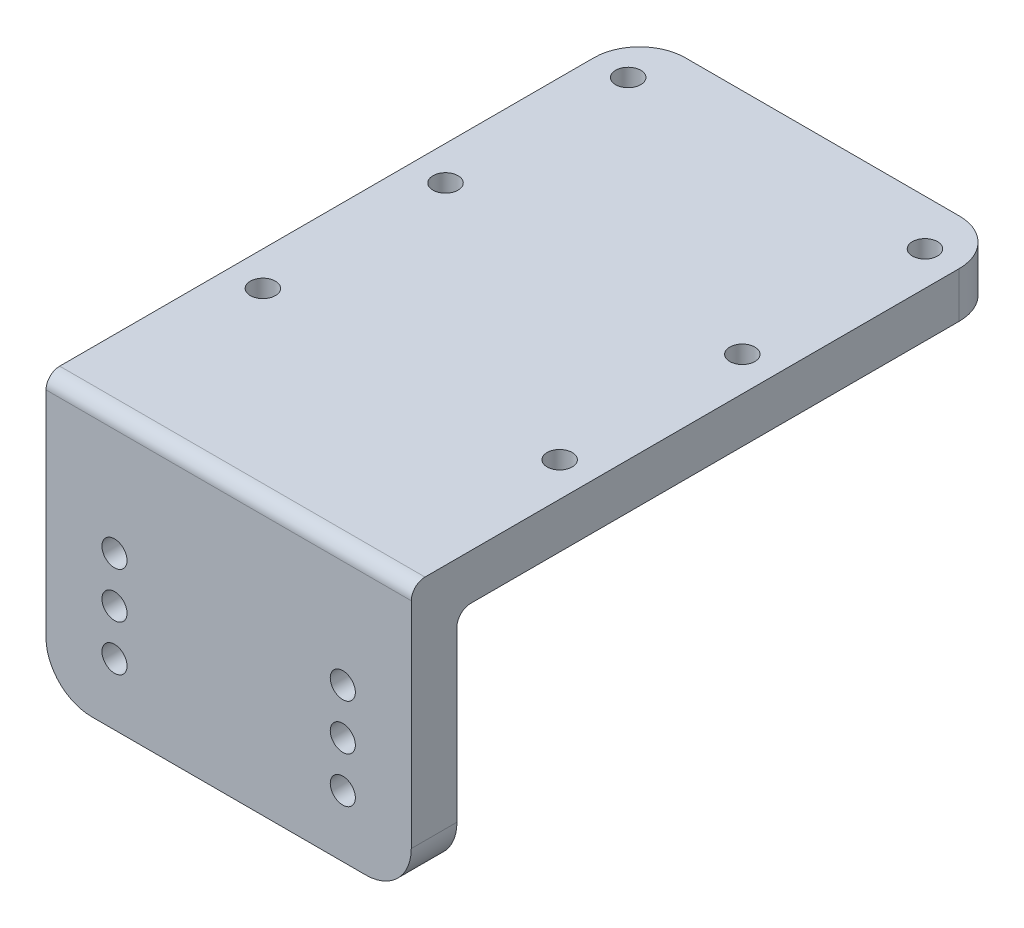
ISO-10303-21;
HEADER;
FILE_DESCRIPTION(('STEP AP214'),'2;1');
FILE_NAME('part.step','',(''),(''),'','','');
FILE_SCHEMA(('AUTOMOTIVE_DESIGN { 1 0 10303 214 1 1 1 1 }'));
ENDSEC;
DATA;
#1=APPLICATION_CONTEXT('core data for automotive mechanical design processes');
#2=APPLICATION_PROTOCOL_DEFINITION('international standard','automotive_design',2000,#1);
#3=PRODUCT_CONTEXT('',#1,'mechanical');
#4=PRODUCT('Part','Part','',(#3));
#5=PRODUCT_RELATED_PRODUCT_CATEGORY('part','',(#4));
#6=PRODUCT_DEFINITION_FORMATION('','',#4);
#7=PRODUCT_DEFINITION_CONTEXT('part definition',#1,'design');
#8=PRODUCT_DEFINITION('design','',#6,#7);
#9=PRODUCT_DEFINITION_SHAPE('','',#8);
#10=(LENGTH_UNIT() NAMED_UNIT(*) SI_UNIT(.MILLI.,.METRE.));
#11=(NAMED_UNIT(*) PLANE_ANGLE_UNIT() SI_UNIT($,.RADIAN.));
#12=(NAMED_UNIT(*) SI_UNIT($,.STERADIAN.) SOLID_ANGLE_UNIT());
#13=UNCERTAINTY_MEASURE_WITH_UNIT(LENGTH_MEASURE(1.E-05),#10,'distance_accuracy_value','');
#14=(GEOMETRIC_REPRESENTATION_CONTEXT(3) GLOBAL_UNCERTAINTY_ASSIGNED_CONTEXT((#13)) GLOBAL_UNIT_ASSIGNED_CONTEXT((#10,
#11,#12)) REPRESENTATION_CONTEXT('',''));
#15=CARTESIAN_POINT('',(0.,0.,0.));
#16=DIRECTION('',(0.,0.,1.));
#17=DIRECTION('',(1.,0.,0.));
#18=AXIS2_PLACEMENT_3D('',#15,#16,#17);
#19=CARTESIAN_POINT('',(0.,0.,0.));
#20=DIRECTION('',(0.,0.,1.));
#21=DIRECTION('',(1.,0.,0.));
#22=AXIS2_PLACEMENT_3D('',#19,#20,#21);
#23=PLANE('',#22);
#24=CARTESIAN_POINT('',(-25.,3.50000000000001,0.));
#25=DIRECTION('',(0.,0.,-1.));
#26=DIRECTION('',(-1.,0.,0.));
#27=AXIS2_PLACEMENT_3D('',#24,#25,#26);
#28=CIRCLE('',#27,2.75);
#29=CARTESIAN_POINT('',(-27.75,3.50000000000001,0.));
#30=VERTEX_POINT('',#29);
#31=EDGE_CURVE('E250',#30,#30,#28,.T.);
#32=ORIENTED_EDGE('',*,*,#31,.F.);
#33=EDGE_LOOP('',(#32));
#34=FACE_BOUND('',#33,.T.);
#35=CARTESIAN_POINT('',(-25.,-16.5,0.));
#36=DIRECTION('',(0.,0.,-1.));
#37=DIRECTION('',(-1.,0.,0.));
#38=AXIS2_PLACEMENT_3D('',#35,#36,#37);
#39=CIRCLE('',#38,2.75);
#40=CARTESIAN_POINT('',(-27.75,-16.5,0.));
#41=VERTEX_POINT('',#40);
#42=EDGE_CURVE('E268',#41,#41,#39,.T.);
#43=ORIENTED_EDGE('',*,*,#42,.F.);
#44=EDGE_LOOP('',(#43));
#45=FACE_BOUND('',#44,.T.);
#46=CARTESIAN_POINT('',(-25.,-6.49999999999999,0.));
#47=DIRECTION('',(0.,0.,-1.));
#48=DIRECTION('',(-1.,0.,0.));
#49=AXIS2_PLACEMENT_3D('',#46,#47,#48);
#50=CIRCLE('',#49,2.75);
#51=CARTESIAN_POINT('',(-27.75,-6.49999999999999,0.));
#52=VERTEX_POINT('',#51);
#53=EDGE_CURVE('E256',#52,#52,#50,.T.);
#54=ORIENTED_EDGE('',*,*,#53,.F.);
#55=EDGE_LOOP('',(#54));
#56=FACE_BOUND('',#55,.T.);
#57=DIRECTION('',(0.,-1.,0.));
#58=VECTOR('',#57,1.);
#59=CARTESIAN_POINT('',(-40.,30.,0.));
#60=LINE('',#59,#58);
#61=CARTESIAN_POINT('',(-40.,17.,0.));
#62=VERTEX_POINT('',#61);
#63=CARTESIAN_POINT('',(-40.,-20.,0.));
#64=VERTEX_POINT('',#63);
#65=EDGE_CURVE('E120',#62,#64,#60,.T.);
#66=ORIENTED_EDGE('',*,*,#65,.F.);
#67=DIRECTION('',(-1.,0.,0.));
#68=VECTOR('',#67,1.);
#69=CARTESIAN_POINT('',(-5.,17.,0.));
#70=LINE('',#69,#68);
#71=CARTESIAN_POINT('',(-8.,17.,0.));
#72=VERTEX_POINT('',#71);
#73=EDGE_CURVE('E108',#62,#72,#70,.F.);
#74=ORIENTED_EDGE('',*,*,#73,.T.);
#75=DIRECTION('',(0.,1.,0.));
#76=VECTOR('',#75,1.);
#77=CARTESIAN_POINT('',(-8.,-30.,0.));
#78=LINE('',#77,#76);
#79=CARTESIAN_POINT('',(-8.,-30.,0.));
#80=VERTEX_POINT('',#79);
#81=EDGE_CURVE('E152',#72,#80,#78,.F.);
#82=ORIENTED_EDGE('',*,*,#81,.T.);
#83=DIRECTION('',(1.,0.,0.));
#84=VECTOR('',#83,1.);
#85=CARTESIAN_POINT('',(-40.,-30.,0.));
#86=LINE('',#85,#84);
#87=CARTESIAN_POINT('',(-30.,-30.,0.));
#88=VERTEX_POINT('',#87);
#89=EDGE_CURVE('E297',#88,#80,#86,.T.);
#90=ORIENTED_EDGE('',*,*,#89,.F.);
#91=CARTESIAN_POINT('',(-30.,-20.,0.));
#92=DIRECTION('',(0.,0.,1.));
#93=DIRECTION('',(1.,0.,0.));
#94=AXIS2_PLACEMENT_3D('',#91,#92,#93);
#95=CIRCLE('',#94,10.);
#96=EDGE_CURVE('E339',#88,#64,#95,.F.);
#97=ORIENTED_EDGE('',*,*,#96,.T.);
#98=EDGE_LOOP('',(#66,#74,#82,#90,#97));
#99=FACE_BOUND('',#98,.T.);
#100=ADVANCED_FACE('F34',(#34,#45,#56,#99),#23,.F.);
#101=CARTESIAN_POINT('',(25.,-16.5,0.));
#102=DIRECTION('',(0.,0.,-1.));
#103=DIRECTION('',(-1.,0.,0.));
#104=AXIS2_PLACEMENT_3D('',#101,#102,#103);
#105=CIRCLE('',#104,2.75);
#106=CARTESIAN_POINT('',(22.25,-16.5,0.));
#107=VERTEX_POINT('',#106);
#108=EDGE_CURVE('E280',#107,#107,#105,.T.);
#109=ORIENTED_EDGE('',*,*,#108,.F.);
#110=EDGE_LOOP('',(#109));
#111=FACE_BOUND('',#110,.T.);
#112=CARTESIAN_POINT('',(25.,-6.49999999999999,0.));
#113=DIRECTION('',(0.,0.,-1.));
#114=DIRECTION('',(-1.,0.,0.));
#115=AXIS2_PLACEMENT_3D('',#112,#113,#114);
#116=CIRCLE('',#115,2.75);
#117=CARTESIAN_POINT('',(22.25,-6.49999999999999,0.));
#118=VERTEX_POINT('',#117);
#119=EDGE_CURVE('E275',#118,#118,#116,.T.);
#120=ORIENTED_EDGE('',*,*,#119,.F.);
#121=EDGE_LOOP('',(#120));
#122=FACE_BOUND('',#121,.T.);
#123=CARTESIAN_POINT('',(25.,3.50000000000001,0.));
#124=DIRECTION('',(0.,0.,-1.));
#125=DIRECTION('',(-1.,0.,0.));
#126=AXIS2_PLACEMENT_3D('',#123,#124,#125);
#127=CIRCLE('',#126,2.75);
#128=CARTESIAN_POINT('',(22.25,3.50000000000001,0.));
#129=VERTEX_POINT('',#128);
#130=EDGE_CURVE('E263',#129,#129,#127,.T.);
#131=ORIENTED_EDGE('',*,*,#130,.F.);
#132=EDGE_LOOP('',(#131));
#133=FACE_BOUND('',#132,.T.);
#134=CARTESIAN_POINT('',(8.,-30.,0.));
#135=VERTEX_POINT('',#134);
#136=CARTESIAN_POINT('',(30.,-30.,0.));
#137=VERTEX_POINT('',#136);
#138=EDGE_CURVE('E306',#135,#137,#86,.T.);
#139=ORIENTED_EDGE('',*,*,#138,.F.);
#140=DIRECTION('',(0.,-1.,0.));
#141=VECTOR('',#140,1.);
#142=CARTESIAN_POINT('',(8.,20.,0.));
#143=LINE('',#142,#141);
#144=CARTESIAN_POINT('',(8.,17.,0.));
#145=VERTEX_POINT('',#144);
#146=EDGE_CURVE('E103',#135,#145,#143,.F.);
#147=ORIENTED_EDGE('',*,*,#146,.T.);
#148=DIRECTION('',(-1.,0.,0.));
#149=VECTOR('',#148,1.);
#150=CARTESIAN_POINT('',(40.,17.,0.));
#151=LINE('',#150,#149);
#152=CARTESIAN_POINT('',(40.,17.,0.));
#153=VERTEX_POINT('',#152);
#154=EDGE_CURVE('E96',#145,#153,#151,.F.);
#155=ORIENTED_EDGE('',*,*,#154,.T.);
#156=DIRECTION('',(0.,1.,0.));
#157=VECTOR('',#156,1.);
#158=CARTESIAN_POINT('',(40.,30.,0.));
#159=LINE('',#158,#157);
#160=CARTESIAN_POINT('',(40.,-20.,0.));
#161=VERTEX_POINT('',#160);
#162=EDGE_CURVE('E101',#161,#153,#159,.T.);
#163=ORIENTED_EDGE('',*,*,#162,.F.);
#164=CARTESIAN_POINT('',(30.,-20.,0.));
#165=DIRECTION('',(0.,0.,1.));
#166=DIRECTION('',(1.,0.,0.));
#167=AXIS2_PLACEMENT_3D('',#164,#165,#166);
#168=CIRCLE('',#167,10.);
#169=EDGE_CURVE('E352',#161,#137,#168,.F.);
#170=ORIENTED_EDGE('',*,*,#169,.T.);
#171=EDGE_LOOP('',(#139,#147,#155,#163,#170));
#172=FACE_BOUND('',#171,.T.);
#173=ADVANCED_FACE('F98',(#111,#122,#133,#172),#23,.F.);
#174=CARTESIAN_POINT('',(0.,20.,0.));
#175=DIRECTION('',(0.,1.,0.));
#176=DIRECTION('',(0.,0.,1.));
#177=AXIS2_PLACEMENT_3D('',#174,#175,#176);
#178=PLANE('',#177);
#179=CARTESIAN_POINT('',(-32.5,20.,-110.));
#180=DIRECTION('',(0.,-1.,0.));
#181=DIRECTION('',(0.,0.,-1.));
#182=AXIS2_PLACEMENT_3D('',#179,#180,#181);
#183=CIRCLE('',#182,2.75);
#184=CARTESIAN_POINT('',(-32.5,20.,-112.75));
#185=VERTEX_POINT('',#184);
#186=EDGE_CURVE('E239',#185,#185,#183,.T.);
#187=ORIENTED_EDGE('',*,*,#186,.F.);
#188=EDGE_LOOP('',(#187));
#189=FACE_BOUND('',#188,.T.);
#190=CARTESIAN_POINT('',(-32.5,20.,-30.));
#191=DIRECTION('',(0.,-1.,0.));
#192=DIRECTION('',(0.,0.,-1.));
#193=AXIS2_PLACEMENT_3D('',#190,#191,#192);
#194=CIRCLE('',#193,2.75);
#195=CARTESIAN_POINT('',(-32.5,20.,-32.75));
#196=VERTEX_POINT('',#195);
#197=EDGE_CURVE('E212',#196,#196,#194,.T.);
#198=ORIENTED_EDGE('',*,*,#197,.F.);
#199=EDGE_LOOP('',(#198));
#200=FACE_BOUND('',#199,.T.);
#201=CARTESIAN_POINT('',(-32.5,20.,-70.));
#202=DIRECTION('',(0.,-1.,0.));
#203=DIRECTION('',(0.,0.,-1.));
#204=AXIS2_PLACEMENT_3D('',#201,#202,#203);
#205=CIRCLE('',#204,2.75);
#206=CARTESIAN_POINT('',(-32.5,20.,-72.75));
#207=VERTEX_POINT('',#206);
#208=EDGE_CURVE('E227',#207,#207,#205,.T.);
#209=ORIENTED_EDGE('',*,*,#208,.F.);
#210=EDGE_LOOP('',(#209));
#211=FACE_BOUND('',#210,.T.);
#212=DIRECTION('',(-1.,0.,0.));
#213=VECTOR('',#212,1.);
#214=CARTESIAN_POINT('',(-40.,20.,-120.));
#215=LINE('',#214,#213);
#216=CARTESIAN_POINT('',(-8.,20.,-120.));
#217=VERTEX_POINT('',#216);
#218=CARTESIAN_POINT('',(-30.,20.,-120.));
#219=VERTEX_POINT('',#218);
#220=EDGE_CURVE('E197',#217,#219,#215,.T.);
#221=ORIENTED_EDGE('',*,*,#220,.F.);
#222=DIRECTION('',(0.,0.,1.));
#223=VECTOR('',#222,1.);
#224=CARTESIAN_POINT('',(-8.,20.,0.));
#225=LINE('',#224,#223);
#226=CARTESIAN_POINT('',(-8.,20.,-3.));
#227=VERTEX_POINT('',#226);
#228=EDGE_CURVE('E146',#217,#227,#225,.T.);
#229=ORIENTED_EDGE('',*,*,#228,.T.);
#230=DIRECTION('',(-1.,0.,0.));
#231=VECTOR('',#230,1.);
#232=CARTESIAN_POINT('',(-40.,20.,-3.));
#233=LINE('',#232,#231);
#234=CARTESIAN_POINT('',(-40.,20.,-3.));
#235=VERTEX_POINT('',#234);
#236=EDGE_CURVE('E137',#227,#235,#233,.T.);
#237=ORIENTED_EDGE('',*,*,#236,.T.);
#238=DIRECTION('',(0.,0.,1.));
#239=VECTOR('',#238,1.);
#240=CARTESIAN_POINT('',(-40.,20.,-120.));
#241=LINE('',#240,#239);
#242=CARTESIAN_POINT('',(-40.,20.,-110.));
#243=VERTEX_POINT('',#242);
#244=EDGE_CURVE('E121',#243,#235,#241,.T.);
#245=ORIENTED_EDGE('',*,*,#244,.F.);
#246=CARTESIAN_POINT('',(-30.,20.,-110.));
#247=DIRECTION('',(0.,1.,0.));
#248=DIRECTION('',(0.,0.,1.));
#249=AXIS2_PLACEMENT_3D('',#246,#247,#248);
#250=CIRCLE('',#249,10.);
#251=EDGE_CURVE('E331',#243,#219,#250,.F.);
#252=ORIENTED_EDGE('',*,*,#251,.T.);
#253=EDGE_LOOP('',(#221,#229,#237,#245,#252));
#254=FACE_BOUND('',#253,.T.);
#255=ADVANCED_FACE('F195',(#189,#200,#211,#254),#178,.F.);
#256=CARTESIAN_POINT('',(32.5,20.,-110.));
#257=DIRECTION('',(0.,-1.,0.));
#258=DIRECTION('',(0.,0.,-1.));
#259=AXIS2_PLACEMENT_3D('',#256,#257,#258);
#260=CIRCLE('',#259,2.75);
#261=CARTESIAN_POINT('',(32.5,20.,-112.75));
#262=VERTEX_POINT('',#261);
#263=EDGE_CURVE('E232',#262,#262,#260,.T.);
#264=ORIENTED_EDGE('',*,*,#263,.F.);
#265=EDGE_LOOP('',(#264));
#266=FACE_BOUND('',#265,.T.);
#267=CARTESIAN_POINT('',(32.5,20.,-70.));
#268=DIRECTION('',(0.,-1.,0.));
#269=DIRECTION('',(0.,0.,-1.));
#270=AXIS2_PLACEMENT_3D('',#267,#268,#269);
#271=CIRCLE('',#270,2.75);
#272=CARTESIAN_POINT('',(32.5,20.,-72.75));
#273=VERTEX_POINT('',#272);
#274=EDGE_CURVE('E220',#273,#273,#271,.T.);
#275=ORIENTED_EDGE('',*,*,#274,.F.);
#276=EDGE_LOOP('',(#275));
#277=FACE_BOUND('',#276,.T.);
#278=CARTESIAN_POINT('',(32.5,20.,-30.));
#279=DIRECTION('',(0.,-1.,0.));
#280=DIRECTION('',(0.,0.,-1.));
#281=AXIS2_PLACEMENT_3D('',#278,#279,#280);
#282=CIRCLE('',#281,2.75);
#283=CARTESIAN_POINT('',(32.5,20.,-32.75));
#284=VERTEX_POINT('',#283);
#285=EDGE_CURVE('E219',#284,#284,#282,.T.);
#286=ORIENTED_EDGE('',*,*,#285,.F.);
#287=EDGE_LOOP('',(#286));
#288=FACE_BOUND('',#287,.T.);
#289=DIRECTION('',(-1.,0.,0.));
#290=VECTOR('',#289,1.);
#291=CARTESIAN_POINT('',(5.,20.,-3.));
#292=LINE('',#291,#290);
#293=CARTESIAN_POINT('',(40.,20.,-3.));
#294=VERTEX_POINT('',#293);
#295=CARTESIAN_POINT('',(8.,20.,-3.));
#296=VERTEX_POINT('',#295);
#297=EDGE_CURVE('E126',#294,#296,#292,.T.);
#298=ORIENTED_EDGE('',*,*,#297,.T.);
#299=DIRECTION('',(0.,0.,1.));
#300=VECTOR('',#299,1.);
#301=CARTESIAN_POINT('',(8.,20.,-120.));
#302=LINE('',#301,#300);
#303=CARTESIAN_POINT('',(8.,20.,-120.));
#304=VERTEX_POINT('',#303);
#305=EDGE_CURVE('E134',#296,#304,#302,.F.);
#306=ORIENTED_EDGE('',*,*,#305,.T.);
#307=CARTESIAN_POINT('',(30.,20.,-120.));
#308=VERTEX_POINT('',#307);
#309=EDGE_CURVE('E288',#308,#304,#215,.T.);
#310=ORIENTED_EDGE('',*,*,#309,.F.);
#311=CARTESIAN_POINT('',(30.,20.,-110.));
#312=DIRECTION('',(0.,1.,0.));
#313=DIRECTION('',(0.,0.,1.));
#314=AXIS2_PLACEMENT_3D('',#311,#312,#313);
#315=CIRCLE('',#314,10.);
#316=CARTESIAN_POINT('',(40.,20.,-110.));
#317=VERTEX_POINT('',#316);
#318=EDGE_CURVE('E354',#308,#317,#315,.F.);
#319=ORIENTED_EDGE('',*,*,#318,.T.);
#320=DIRECTION('',(0.,0.,-1.));
#321=VECTOR('',#320,1.);
#322=CARTESIAN_POINT('',(40.,20.,-120.));
#323=LINE('',#322,#321);
#324=EDGE_CURVE('E286',#294,#317,#323,.T.);
#325=ORIENTED_EDGE('',*,*,#324,.F.);
#326=EDGE_LOOP('',(#298,#306,#310,#319,#325));
#327=FACE_BOUND('',#326,.T.);
#328=ADVANCED_FACE('F452',(#266,#277,#288,#327),#178,.F.);
#329=CARTESIAN_POINT('',(40.,30.,10.));
#330=DIRECTION('',(-1.,0.,0.));
#331=DIRECTION('',(0.,-1.,0.));
#332=AXIS2_PLACEMENT_3D('',#329,#330,#331);
#333=PLANE('',#332);
#334=DIRECTION('',(0.,0.,-1.));
#335=VECTOR('',#334,1.);
#336=CARTESIAN_POINT('',(40.,30.,10.));
#337=LINE('',#336,#335);
#338=CARTESIAN_POINT('',(40.,30.,7.));
#339=VERTEX_POINT('',#338);
#340=CARTESIAN_POINT('',(40.,30.,-110.));
#341=VERTEX_POINT('',#340);
#342=EDGE_CURVE('E310',#339,#341,#337,.T.);
#343=ORIENTED_EDGE('',*,*,#342,.F.);
#344=CARTESIAN_POINT('',(40.,27.,7.));
#345=DIRECTION('',(-1.,0.,0.));
#346=DIRECTION('',(0.,-1.,0.));
#347=AXIS2_PLACEMENT_3D('',#344,#345,#346);
#348=CIRCLE('',#347,3.);
#349=CARTESIAN_POINT('',(40.,27.,10.));
#350=VERTEX_POINT('',#349);
#351=EDGE_CURVE('E366',#339,#350,#348,.F.);
#352=ORIENTED_EDGE('',*,*,#351,.T.);
#353=DIRECTION('',(0.,1.,0.));
#354=VECTOR('',#353,1.);
#355=CARTESIAN_POINT('',(40.,30.,10.));
#356=LINE('',#355,#354);
#357=CARTESIAN_POINT('',(40.,-20.,10.));
#358=VERTEX_POINT('',#357);
#359=EDGE_CURVE('E293',#358,#350,#356,.T.);
#360=ORIENTED_EDGE('',*,*,#359,.F.);
#361=DIRECTION('',(0.,0.,-1.));
#362=VECTOR('',#361,1.);
#363=CARTESIAN_POINT('',(40.,-20.,10.));
#364=LINE('',#363,#362);
#365=EDGE_CURVE('E119',#358,#161,#364,.T.);
#366=ORIENTED_EDGE('',*,*,#365,.T.);
#367=ORIENTED_EDGE('',*,*,#162,.T.);
#368=CARTESIAN_POINT('',(40.,17.,-3.));
#369=DIRECTION('',(-1.,0.,0.));
#370=DIRECTION('',(0.,-1.,0.));
#371=AXIS2_PLACEMENT_3D('',#368,#369,#370);
#372=CIRCLE('',#371,3.);
#373=EDGE_CURVE('E11',#153,#294,#372,.T.);
#374=ORIENTED_EDGE('',*,*,#373,.T.);
#375=ORIENTED_EDGE('',*,*,#324,.T.);
#376=DIRECTION('',(0.,1.,0.));
#377=VECTOR('',#376,1.);
#378=CARTESIAN_POINT('',(40.,30.,-110.));
#379=LINE('',#378,#377);
#380=EDGE_CURVE('E348',#317,#341,#379,.T.);
#381=ORIENTED_EDGE('',*,*,#380,.T.);
#382=EDGE_LOOP('',(#343,#352,#360,#366,#367,#374,#375,#381));
#383=FACE_BOUND('',#382,.T.);
#384=ADVANCED_FACE('F113',(#383),#333,.F.);
#385=CARTESIAN_POINT('',(-40.,30.,10.));
#386=DIRECTION('',(0.,-1.,0.));
#387=DIRECTION('',(0.,0.,-1.));
#388=AXIS2_PLACEMENT_3D('',#385,#386,#387);
#389=PLANE('',#388);
#390=CARTESIAN_POINT('',(32.5,30.,-30.));
#391=DIRECTION('',(0.,-1.,0.));
#392=DIRECTION('',(0.,0.,-1.));
#393=AXIS2_PLACEMENT_3D('',#390,#391,#392);
#394=CIRCLE('',#393,2.75);
#395=CARTESIAN_POINT('',(32.5,30.,-32.75));
#396=VERTEX_POINT('',#395);
#397=EDGE_CURVE('E224',#396,#396,#394,.F.);
#398=ORIENTED_EDGE('',*,*,#397,.F.);
#399=EDGE_LOOP('',(#398));
#400=FACE_BOUND('',#399,.T.);
#401=CARTESIAN_POINT('',(32.5,30.,-70.));
#402=DIRECTION('',(0.,-1.,0.));
#403=DIRECTION('',(0.,0.,-1.));
#404=AXIS2_PLACEMENT_3D('',#401,#402,#403);
#405=CIRCLE('',#404,2.75);
#406=CARTESIAN_POINT('',(32.5,30.,-72.75));
#407=VERTEX_POINT('',#406);
#408=EDGE_CURVE('E223',#407,#407,#405,.F.);
#409=ORIENTED_EDGE('',*,*,#408,.F.);
#410=EDGE_LOOP('',(#409));
#411=FACE_BOUND('',#410,.T.);
#412=CARTESIAN_POINT('',(-32.5,30.,-70.));
#413=DIRECTION('',(0.,-1.,0.));
#414=DIRECTION('',(0.,0.,-1.));
#415=AXIS2_PLACEMENT_3D('',#412,#413,#414);
#416=CIRCLE('',#415,2.75);
#417=CARTESIAN_POINT('',(-32.5,30.,-72.75));
#418=VERTEX_POINT('',#417);
#419=EDGE_CURVE('E236',#418,#418,#416,.F.);
#420=ORIENTED_EDGE('',*,*,#419,.F.);
#421=EDGE_LOOP('',(#420));
#422=FACE_BOUND('',#421,.T.);
#423=CARTESIAN_POINT('',(32.5,30.,-110.));
#424=DIRECTION('',(0.,-1.,0.));
#425=DIRECTION('',(0.,0.,-1.));
#426=AXIS2_PLACEMENT_3D('',#423,#424,#425);
#427=CIRCLE('',#426,2.75);
#428=CARTESIAN_POINT('',(32.5,30.,-112.75));
#429=VERTEX_POINT('',#428);
#430=EDGE_CURVE('E235',#429,#429,#427,.F.);
#431=ORIENTED_EDGE('',*,*,#430,.F.);
#432=EDGE_LOOP('',(#431));
#433=FACE_BOUND('',#432,.T.);
#434=CARTESIAN_POINT('',(-32.5,30.,-30.));
#435=DIRECTION('',(0.,-1.,0.));
#436=DIRECTION('',(0.,0.,-1.));
#437=AXIS2_PLACEMENT_3D('',#434,#435,#436);
#438=CIRCLE('',#437,2.75);
#439=CARTESIAN_POINT('',(-32.5,30.,-32.75));
#440=VERTEX_POINT('',#439);
#441=EDGE_CURVE('E216',#440,#440,#438,.F.);
#442=ORIENTED_EDGE('',*,*,#441,.F.);
#443=EDGE_LOOP('',(#442));
#444=FACE_BOUND('',#443,.T.);
#445=CARTESIAN_POINT('',(-32.5,30.,-110.));
#446=DIRECTION('',(0.,-1.,0.));
#447=DIRECTION('',(0.,0.,-1.));
#448=AXIS2_PLACEMENT_3D('',#445,#446,#447);
#449=CIRCLE('',#448,2.75);
#450=CARTESIAN_POINT('',(-32.5,30.,-112.75));
#451=VERTEX_POINT('',#450);
#452=EDGE_CURVE('E246',#451,#451,#449,.F.);
#453=ORIENTED_EDGE('',*,*,#452,.F.);
#454=EDGE_LOOP('',(#453));
#455=FACE_BOUND('',#454,.T.);
#456=DIRECTION('',(0.,0.,-1.));
#457=VECTOR('',#456,1.);
#458=CARTESIAN_POINT('',(-40.,30.,10.));
#459=LINE('',#458,#457);
#460=CARTESIAN_POINT('',(-40.,30.,7.));
#461=VERTEX_POINT('',#460);
#462=CARTESIAN_POINT('',(-40.,30.,-110.));
#463=VERTEX_POINT('',#462);
#464=EDGE_CURVE('E302',#461,#463,#459,.T.);
#465=ORIENTED_EDGE('',*,*,#464,.F.);
#466=DIRECTION('',(-1.,0.,0.));
#467=VECTOR('',#466,1.);
#468=CARTESIAN_POINT('',(40.,30.,7.));
#469=LINE('',#468,#467);
#470=EDGE_CURVE('E363',#461,#339,#469,.F.);
#471=ORIENTED_EDGE('',*,*,#470,.T.);
#472=ORIENTED_EDGE('',*,*,#342,.T.);
#473=CARTESIAN_POINT('',(30.,30.,-110.));
#474=DIRECTION('',(0.,-1.,0.));
#475=DIRECTION('',(0.,0.,-1.));
#476=AXIS2_PLACEMENT_3D('',#473,#474,#475);
#477=CIRCLE('',#476,10.);
#478=CARTESIAN_POINT('',(30.,30.,-120.));
#479=VERTEX_POINT('',#478);
#480=EDGE_CURVE('E319',#341,#479,#477,.F.);
#481=ORIENTED_EDGE('',*,*,#480,.T.);
#482=DIRECTION('',(-1.,0.,0.));
#483=VECTOR('',#482,1.);
#484=CARTESIAN_POINT('',(-40.,30.,-120.));
#485=LINE('',#484,#483);
#486=CARTESIAN_POINT('',(-30.,30.,-120.));
#487=VERTEX_POINT('',#486);
#488=EDGE_CURVE('E283',#479,#487,#485,.T.);
#489=ORIENTED_EDGE('',*,*,#488,.T.);
#490=CARTESIAN_POINT('',(-30.,30.,-110.));
#491=DIRECTION('',(0.,-1.,0.));
#492=DIRECTION('',(0.,0.,-1.));
#493=AXIS2_PLACEMENT_3D('',#490,#491,#492);
#494=CIRCLE('',#493,10.);
#495=EDGE_CURVE('E322',#487,#463,#494,.F.);
#496=ORIENTED_EDGE('',*,*,#495,.T.);
#497=EDGE_LOOP('',(#465,#471,#472,#481,#489,#496));
#498=FACE_BOUND('',#497,.T.);
#499=ADVANCED_FACE('F443',(#400,#411,#422,#433,#444,#455,#498),#389,.F.);
#500=CARTESIAN_POINT('',(-40.,30.,10.));
#501=DIRECTION('',(1.,0.,0.));
#502=DIRECTION('',(0.,1.,0.));
#503=AXIS2_PLACEMENT_3D('',#500,#501,#502);
#504=PLANE('',#503);
#505=DIRECTION('',(0.,-1.,0.));
#506=VECTOR('',#505,1.);
#507=CARTESIAN_POINT('',(-40.,30.,10.));
#508=LINE('',#507,#506);
#509=CARTESIAN_POINT('',(-40.,27.,10.));
#510=VERTEX_POINT('',#509);
#511=CARTESIAN_POINT('',(-40.,-20.,10.));
#512=VERTEX_POINT('',#511);
#513=EDGE_CURVE('E296',#510,#512,#508,.T.);
#514=ORIENTED_EDGE('',*,*,#513,.F.);
#515=CARTESIAN_POINT('',(-40.,27.,7.));
#516=DIRECTION('',(1.,0.,0.));
#517=DIRECTION('',(0.,1.,0.));
#518=AXIS2_PLACEMENT_3D('',#515,#516,#517);
#519=CIRCLE('',#518,3.);
#520=EDGE_CURVE('E360',#510,#461,#519,.F.);
#521=ORIENTED_EDGE('',*,*,#520,.T.);
#522=ORIENTED_EDGE('',*,*,#464,.T.);
#523=DIRECTION('',(0.,1.,0.));
#524=VECTOR('',#523,1.);
#525=CARTESIAN_POINT('',(-40.,20.,-110.));
#526=LINE('',#525,#524);
#527=EDGE_CURVE('E328',#463,#243,#526,.F.);
#528=ORIENTED_EDGE('',*,*,#527,.T.);
#529=ORIENTED_EDGE('',*,*,#244,.T.);
#530=CARTESIAN_POINT('',(-40.,17.,-3.));
#531=DIRECTION('',(1.,0.,0.));
#532=DIRECTION('',(0.,1.,0.));
#533=AXIS2_PLACEMENT_3D('',#530,#531,#532);
#534=CIRCLE('',#533,3.);
#535=EDGE_CURVE('E162',#235,#62,#534,.T.);
#536=ORIENTED_EDGE('',*,*,#535,.T.);
#537=ORIENTED_EDGE('',*,*,#65,.T.);
#538=DIRECTION('',(0.,0.,-1.));
#539=VECTOR('',#538,1.);
#540=CARTESIAN_POINT('',(-40.,-20.,10.));
#541=LINE('',#540,#539);
#542=EDGE_CURVE('E325',#64,#512,#541,.F.);
#543=ORIENTED_EDGE('',*,*,#542,.T.);
#544=EDGE_LOOP('',(#514,#521,#522,#528,#529,#536,#537,#543));
#545=FACE_BOUND('',#544,.T.);
#546=ADVANCED_FACE('F461',(#545),#504,.F.);
#547=CARTESIAN_POINT('',(-40.,-30.,10.));
#548=DIRECTION('',(0.,1.,0.));
#549=DIRECTION('',(0.,0.,1.));
#550=AXIS2_PLACEMENT_3D('',#547,#548,#549);
#551=PLANE('',#550);
#552=DIRECTION('',(1.,0.,0.));
#553=VECTOR('',#552,1.);
#554=CARTESIAN_POINT('',(-40.,-30.,10.));
#555=LINE('',#554,#553);
#556=CARTESIAN_POINT('',(-30.,-30.,10.));
#557=VERTEX_POINT('',#556);
#558=CARTESIAN_POINT('',(30.,-30.,10.));
#559=VERTEX_POINT('',#558);
#560=EDGE_CURVE('E300',#557,#559,#555,.T.);
#561=ORIENTED_EDGE('',*,*,#560,.F.);
#562=DIRECTION('',(0.,0.,-1.));
#563=VECTOR('',#562,1.);
#564=CARTESIAN_POINT('',(-30.,-30.,10.));
#565=LINE('',#564,#563);
#566=EDGE_CURVE('E336',#557,#88,#565,.T.);
#567=ORIENTED_EDGE('',*,*,#566,.T.);
#568=ORIENTED_EDGE('',*,*,#89,.T.);
#569=DIRECTION('',(-1.,0.,0.));
#570=VECTOR('',#569,1.);
#571=CARTESIAN_POINT('',(40.001,-30.,0.));
#572=LINE('',#571,#570);
#573=EDGE_CURVE('E51',#135,#80,#572,.T.);
#574=ORIENTED_EDGE('',*,*,#573,.F.);
#575=ORIENTED_EDGE('',*,*,#138,.T.);
#576=DIRECTION('',(0.,0.,-1.));
#577=VECTOR('',#576,1.);
#578=CARTESIAN_POINT('',(30.,-30.,10.));
#579=LINE('',#578,#577);
#580=EDGE_CURVE('E333',#137,#559,#579,.F.);
#581=ORIENTED_EDGE('',*,*,#580,.T.);
#582=EDGE_LOOP('',(#561,#567,#568,#574,#575,#581));
#583=FACE_BOUND('',#582,.T.);
#584=ADVANCED_FACE('F470',(#583),#551,.F.);
#585=CARTESIAN_POINT('',(0.,0.,10.));
#586=DIRECTION('',(0.,0.,1.));
#587=DIRECTION('',(1.,0.,0.));
#588=AXIS2_PLACEMENT_3D('',#585,#586,#587);
#589=PLANE('',#588);
#590=CARTESIAN_POINT('',(25.,3.50000000000001,10.));
#591=DIRECTION('',(0.,0.,1.));
#592=DIRECTION('',(1.,0.,0.));
#593=AXIS2_PLACEMENT_3D('',#590,#591,#592);
#594=CIRCLE('',#593,2.75);
#595=CARTESIAN_POINT('',(27.75,3.50000000000001,10.));
#596=VERTEX_POINT('',#595);
#597=EDGE_CURVE('E253',#596,#596,#594,.F.);
#598=ORIENTED_EDGE('',*,*,#597,.T.);
#599=EDGE_LOOP('',(#598));
#600=FACE_BOUND('',#599,.T.);
#601=CARTESIAN_POINT('',(-25.,-6.49999999999999,10.));
#602=DIRECTION('',(0.,0.,1.));
#603=DIRECTION('',(1.,0.,0.));
#604=AXIS2_PLACEMENT_3D('',#601,#602,#603);
#605=CIRCLE('',#604,2.75);
#606=CARTESIAN_POINT('',(-22.25,-6.49999999999999,10.));
#607=VERTEX_POINT('',#606);
#608=EDGE_CURVE('E260',#607,#607,#605,.F.);
#609=ORIENTED_EDGE('',*,*,#608,.T.);
#610=EDGE_LOOP('',(#609));
#611=FACE_BOUND('',#610,.T.);
#612=CARTESIAN_POINT('',(25.,-6.49999999999999,10.));
#613=DIRECTION('',(0.,0.,1.));
#614=DIRECTION('',(1.,0.,0.));
#615=AXIS2_PLACEMENT_3D('',#612,#613,#614);
#616=CIRCLE('',#615,2.75);
#617=CARTESIAN_POINT('',(27.75,-6.49999999999999,10.));
#618=VERTEX_POINT('',#617);
#619=EDGE_CURVE('E259',#618,#618,#616,.F.);
#620=ORIENTED_EDGE('',*,*,#619,.T.);
#621=EDGE_LOOP('',(#620));
#622=FACE_BOUND('',#621,.T.);
#623=CARTESIAN_POINT('',(-25.,-16.5,10.));
#624=DIRECTION('',(0.,0.,1.));
#625=DIRECTION('',(1.,0.,0.));
#626=AXIS2_PLACEMENT_3D('',#623,#624,#625);
#627=CIRCLE('',#626,2.75);
#628=CARTESIAN_POINT('',(-22.25,-16.5,10.));
#629=VERTEX_POINT('',#628);
#630=EDGE_CURVE('E272',#629,#629,#627,.F.);
#631=ORIENTED_EDGE('',*,*,#630,.T.);
#632=EDGE_LOOP('',(#631));
#633=FACE_BOUND('',#632,.T.);
#634=CARTESIAN_POINT('',(-25.,3.50000000000001,10.));
#635=DIRECTION('',(0.,0.,1.));
#636=DIRECTION('',(1.,0.,0.));
#637=AXIS2_PLACEMENT_3D('',#634,#635,#636);
#638=CIRCLE('',#637,2.75);
#639=CARTESIAN_POINT('',(-22.25,3.50000000000001,10.));
#640=VERTEX_POINT('',#639);
#641=EDGE_CURVE('E249',#640,#640,#638,.F.);
#642=ORIENTED_EDGE('',*,*,#641,.T.);
#643=EDGE_LOOP('',(#642));
#644=FACE_BOUND('',#643,.T.);
#645=CARTESIAN_POINT('',(25.,-16.5,10.));
#646=DIRECTION('',(0.,0.,1.));
#647=DIRECTION('',(1.,0.,0.));
#648=AXIS2_PLACEMENT_3D('',#645,#646,#647);
#649=CIRCLE('',#648,2.75);
#650=CARTESIAN_POINT('',(27.75,-16.5,10.));
#651=VERTEX_POINT('',#650);
#652=EDGE_CURVE('E271',#651,#651,#649,.F.);
#653=ORIENTED_EDGE('',*,*,#652,.T.);
#654=EDGE_LOOP('',(#653));
#655=FACE_BOUND('',#654,.T.);
#656=ORIENTED_EDGE('',*,*,#359,.T.);
#657=DIRECTION('',(-1.,0.,0.));
#658=VECTOR('',#657,1.);
#659=CARTESIAN_POINT('',(-40.,27.,10.));
#660=LINE('',#659,#658);
#661=EDGE_CURVE('E357',#350,#510,#660,.T.);
#662=ORIENTED_EDGE('',*,*,#661,.T.);
#663=ORIENTED_EDGE('',*,*,#513,.T.);
#664=CARTESIAN_POINT('',(-30.,-20.,10.));
#665=DIRECTION('',(0.,0.,1.));
#666=DIRECTION('',(1.,0.,0.));
#667=AXIS2_PLACEMENT_3D('',#664,#665,#666);
#668=CIRCLE('',#667,10.);
#669=EDGE_CURVE('E345',#512,#557,#668,.T.);
#670=ORIENTED_EDGE('',*,*,#669,.T.);
#671=ORIENTED_EDGE('',*,*,#560,.T.);
#672=CARTESIAN_POINT('',(30.,-20.,10.));
#673=DIRECTION('',(0.,0.,1.));
#674=DIRECTION('',(1.,0.,0.));
#675=AXIS2_PLACEMENT_3D('',#672,#673,#674);
#676=CIRCLE('',#675,10.);
#677=EDGE_CURVE('E342',#559,#358,#676,.T.);
#678=ORIENTED_EDGE('',*,*,#677,.T.);
#679=EDGE_LOOP('',(#656,#662,#663,#670,#671,#678));
#680=FACE_BOUND('',#679,.T.);
#681=ADVANCED_FACE('F459',(#600,#611,#622,#633,#644,#655,#680),#589,.T.);
#682=CARTESIAN_POINT('',(-40.,20.,-120.));
#683=DIRECTION('',(0.,0.,-1.));
#684=DIRECTION('',(-1.,0.,0.));
#685=AXIS2_PLACEMENT_3D('',#682,#683,#684);
#686=PLANE('',#685);
#687=DIRECTION('',(-1.,0.,0.));
#688=VECTOR('',#687,1.);
#689=CARTESIAN_POINT('',(40.001,20.,-120.));
#690=LINE('',#689,#688);
#691=EDGE_CURVE('E60',#304,#217,#690,.T.);
#692=ORIENTED_EDGE('',*,*,#691,.T.);
#693=ORIENTED_EDGE('',*,*,#220,.T.);
#694=DIRECTION('',(0.,1.,0.));
#695=VECTOR('',#694,1.);
#696=CARTESIAN_POINT('',(-30.,30.,-120.));
#697=LINE('',#696,#695);
#698=EDGE_CURVE('E316',#219,#487,#697,.T.);
#699=ORIENTED_EDGE('',*,*,#698,.T.);
#700=ORIENTED_EDGE('',*,*,#488,.F.);
#701=DIRECTION('',(0.,1.,0.));
#702=VECTOR('',#701,1.);
#703=CARTESIAN_POINT('',(30.,20.,-120.));
#704=LINE('',#703,#702);
#705=EDGE_CURVE('E313',#479,#308,#704,.F.);
#706=ORIENTED_EDGE('',*,*,#705,.T.);
#707=ORIENTED_EDGE('',*,*,#309,.T.);
#708=EDGE_LOOP('',(#692,#693,#699,#700,#706,#707));
#709=FACE_BOUND('',#708,.T.);
#710=ADVANCED_FACE('F434',(#709),#686,.T.);
#711=CARTESIAN_POINT('',(25.,-16.5,10.001));
#712=DIRECTION('',(0.,0.,-1.));
#713=DIRECTION('',(-1.,0.,0.));
#714=AXIS2_PLACEMENT_3D('',#711,#712,#713);
#715=CYLINDRICAL_SURFACE('',#714,2.75);
#716=ORIENTED_EDGE('',*,*,#652,.F.);
#717=EDGE_LOOP('',(#716));
#718=FACE_BOUND('',#717,.T.);
#719=ORIENTED_EDGE('',*,*,#108,.T.);
#720=EDGE_LOOP('',(#719));
#721=FACE_BOUND('',#720,.T.);
#722=ADVANCED_FACE('F545',(#718,#721),#715,.F.);
#723=CARTESIAN_POINT('',(-25.,3.50000000000001,10.001));
#724=DIRECTION('',(0.,0.,-1.));
#725=DIRECTION('',(-1.,0.,0.));
#726=AXIS2_PLACEMENT_3D('',#723,#724,#725);
#727=CYLINDRICAL_SURFACE('',#726,2.75);
#728=ORIENTED_EDGE('',*,*,#641,.F.);
#729=EDGE_LOOP('',(#728));
#730=FACE_BOUND('',#729,.T.);
#731=ORIENTED_EDGE('',*,*,#31,.T.);
#732=EDGE_LOOP('',(#731));
#733=FACE_BOUND('',#732,.T.);
#734=ADVANCED_FACE('F541',(#730,#733),#727,.F.);
#735=CARTESIAN_POINT('',(-25.,-16.5,10.001));
#736=DIRECTION('',(0.,0.,-1.));
#737=DIRECTION('',(-1.,0.,0.));
#738=AXIS2_PLACEMENT_3D('',#735,#736,#737);
#739=CYLINDRICAL_SURFACE('',#738,2.75);
#740=ORIENTED_EDGE('',*,*,#630,.F.);
#741=EDGE_LOOP('',(#740));
#742=FACE_BOUND('',#741,.T.);
#743=ORIENTED_EDGE('',*,*,#42,.T.);
#744=EDGE_LOOP('',(#743));
#745=FACE_BOUND('',#744,.T.);
#746=ADVANCED_FACE('F544',(#742,#745),#739,.F.);
#747=CARTESIAN_POINT('',(25.,-6.49999999999999,10.001));
#748=DIRECTION('',(0.,0.,-1.));
#749=DIRECTION('',(-1.,0.,0.));
#750=AXIS2_PLACEMENT_3D('',#747,#748,#749);
#751=CYLINDRICAL_SURFACE('',#750,2.75);
#752=ORIENTED_EDGE('',*,*,#619,.F.);
#753=EDGE_LOOP('',(#752));
#754=FACE_BOUND('',#753,.T.);
#755=ORIENTED_EDGE('',*,*,#119,.T.);
#756=EDGE_LOOP('',(#755));
#757=FACE_BOUND('',#756,.T.);
#758=ADVANCED_FACE('F550',(#754,#757),#751,.F.);
#759=CARTESIAN_POINT('',(-25.,-6.49999999999999,10.001));
#760=DIRECTION('',(0.,0.,-1.));
#761=DIRECTION('',(-1.,0.,0.));
#762=AXIS2_PLACEMENT_3D('',#759,#760,#761);
#763=CYLINDRICAL_SURFACE('',#762,2.75);
#764=ORIENTED_EDGE('',*,*,#608,.F.);
#765=EDGE_LOOP('',(#764));
#766=FACE_BOUND('',#765,.T.);
#767=ORIENTED_EDGE('',*,*,#53,.T.);
#768=EDGE_LOOP('',(#767));
#769=FACE_BOUND('',#768,.T.);
#770=ADVANCED_FACE('F547',(#766,#769),#763,.F.);
#771=CARTESIAN_POINT('',(25.,3.50000000000001,10.001));
#772=DIRECTION('',(0.,0.,-1.));
#773=DIRECTION('',(-1.,0.,0.));
#774=AXIS2_PLACEMENT_3D('',#771,#772,#773);
#775=CYLINDRICAL_SURFACE('',#774,2.75);
#776=ORIENTED_EDGE('',*,*,#597,.F.);
#777=EDGE_LOOP('',(#776));
#778=FACE_BOUND('',#777,.T.);
#779=ORIENTED_EDGE('',*,*,#130,.T.);
#780=EDGE_LOOP('',(#779));
#781=FACE_BOUND('',#780,.T.);
#782=ADVANCED_FACE('F539',(#778,#781),#775,.F.);
#783=CARTESIAN_POINT('',(-32.5,30.001,-110.));
#784=DIRECTION('',(0.,-1.,0.));
#785=DIRECTION('',(0.,0.,-1.));
#786=AXIS2_PLACEMENT_3D('',#783,#784,#785);
#787=CYLINDRICAL_SURFACE('',#786,2.75);
#788=ORIENTED_EDGE('',*,*,#186,.T.);
#789=EDGE_LOOP('',(#788));
#790=FACE_BOUND('',#789,.T.);
#791=ORIENTED_EDGE('',*,*,#452,.T.);
#792=EDGE_LOOP('',(#791));
#793=FACE_BOUND('',#792,.T.);
#794=ADVANCED_FACE('F521',(#790,#793),#787,.F.);
#795=CARTESIAN_POINT('',(-32.5,30.001,-30.));
#796=DIRECTION('',(0.,-1.,0.));
#797=DIRECTION('',(0.,0.,-1.));
#798=AXIS2_PLACEMENT_3D('',#795,#796,#797);
#799=CYLINDRICAL_SURFACE('',#798,2.75);
#800=ORIENTED_EDGE('',*,*,#197,.T.);
#801=EDGE_LOOP('',(#800));
#802=FACE_BOUND('',#801,.T.);
#803=ORIENTED_EDGE('',*,*,#441,.T.);
#804=EDGE_LOOP('',(#803));
#805=FACE_BOUND('',#804,.T.);
#806=ADVANCED_FACE('F517',(#802,#805),#799,.F.);
#807=CARTESIAN_POINT('',(32.5,30.001,-110.));
#808=DIRECTION('',(0.,-1.,0.));
#809=DIRECTION('',(0.,0.,-1.));
#810=AXIS2_PLACEMENT_3D('',#807,#808,#809);
#811=CYLINDRICAL_SURFACE('',#810,2.75);
#812=ORIENTED_EDGE('',*,*,#263,.T.);
#813=EDGE_LOOP('',(#812));
#814=FACE_BOUND('',#813,.T.);
#815=ORIENTED_EDGE('',*,*,#430,.T.);
#816=EDGE_LOOP('',(#815));
#817=FACE_BOUND('',#816,.T.);
#818=ADVANCED_FACE('F520',(#814,#817),#811,.F.);
#819=CARTESIAN_POINT('',(-32.5,30.001,-70.));
#820=DIRECTION('',(0.,-1.,0.));
#821=DIRECTION('',(0.,0.,-1.));
#822=AXIS2_PLACEMENT_3D('',#819,#820,#821);
#823=CYLINDRICAL_SURFACE('',#822,2.75);
#824=ORIENTED_EDGE('',*,*,#208,.T.);
#825=EDGE_LOOP('',(#824));
#826=FACE_BOUND('',#825,.T.);
#827=ORIENTED_EDGE('',*,*,#419,.T.);
#828=EDGE_LOOP('',(#827));
#829=FACE_BOUND('',#828,.T.);
#830=ADVANCED_FACE('F526',(#826,#829),#823,.F.);
#831=CARTESIAN_POINT('',(32.5,30.001,-70.));
#832=DIRECTION('',(0.,-1.,0.));
#833=DIRECTION('',(0.,0.,-1.));
#834=AXIS2_PLACEMENT_3D('',#831,#832,#833);
#835=CYLINDRICAL_SURFACE('',#834,2.75);
#836=ORIENTED_EDGE('',*,*,#274,.T.);
#837=EDGE_LOOP('',(#836));
#838=FACE_BOUND('',#837,.T.);
#839=ORIENTED_EDGE('',*,*,#408,.T.);
#840=EDGE_LOOP('',(#839));
#841=FACE_BOUND('',#840,.T.);
#842=ADVANCED_FACE('F523',(#838,#841),#835,.F.);
#843=CARTESIAN_POINT('',(32.5,30.001,-30.));
#844=DIRECTION('',(0.,-1.,0.));
#845=DIRECTION('',(0.,0.,-1.));
#846=AXIS2_PLACEMENT_3D('',#843,#844,#845);
#847=CYLINDRICAL_SURFACE('',#846,2.75);
#848=ORIENTED_EDGE('',*,*,#285,.T.);
#849=EDGE_LOOP('',(#848));
#850=FACE_BOUND('',#849,.T.);
#851=ORIENTED_EDGE('',*,*,#397,.T.);
#852=EDGE_LOOP('',(#851));
#853=FACE_BOUND('',#852,.T.);
#854=ADVANCED_FACE('F516',(#850,#853),#847,.F.);
#855=CARTESIAN_POINT('',(-5.,-30.,-170.990195135928));
#856=DIRECTION('',(1.,0.,0.));
#857=DIRECTION('',(0.,0.,-1.));
#858=AXIS2_PLACEMENT_3D('',#855,#856,#857);
#859=PLANE('',#858);
#860=DIRECTION('',(0.,1.,0.));
#861=VECTOR('',#860,1.);
#862=CARTESIAN_POINT('',(-5.,20.,-3.));
#863=LINE('',#862,#861);
#864=CARTESIAN_POINT('',(-5.,-28.75,-3.));
#865=VERTEX_POINT('',#864);
#866=CARTESIAN_POINT('',(-5.,17.,-3.));
#867=VERTEX_POINT('',#866);
#868=EDGE_CURVE('E84',#865,#867,#863,.T.);
#869=ORIENTED_EDGE('',*,*,#868,.T.);
#870=DIRECTION('',(0.,0.,1.));
#871=VECTOR('',#870,1.);
#872=CARTESIAN_POINT('',(-5.,17.,-120.));
#873=LINE('',#872,#871);
#874=CARTESIAN_POINT('',(-5.,17.,-112.8));
#875=VERTEX_POINT('',#874);
#876=EDGE_CURVE('E150',#867,#875,#873,.F.);
#877=ORIENTED_EDGE('',*,*,#876,.T.);
#878=DIRECTION('',(0.,0.384615384615385,-0.923076923076923));
#879=VECTOR('',#878,1.);
#880=CARTESIAN_POINT('',(-5.,-30.,0.));
#881=LINE('',#880,#879);
#882=EDGE_CURVE('E204',#865,#875,#881,.T.);
#883=ORIENTED_EDGE('',*,*,#882,.F.);
#884=EDGE_LOOP('',(#869,#877,#883));
#885=FACE_BOUND('',#884,.T.);
#886=ADVANCED_FACE('F203',(#885),#859,.F.);
#887=CARTESIAN_POINT('',(5.,-30.,-170.990195135928));
#888=DIRECTION('',(-1.,0.,0.));
#889=DIRECTION('',(0.,0.,1.));
#890=AXIS2_PLACEMENT_3D('',#887,#888,#889);
#891=PLANE('',#890);
#892=DIRECTION('',(0.,-0.384615384615385,0.923076923076923));
#893=VECTOR('',#892,1.);
#894=CARTESIAN_POINT('',(5.,-30.,0.));
#895=LINE('',#894,#893);
#896=CARTESIAN_POINT('',(5.,17.,-112.8));
#897=VERTEX_POINT('',#896);
#898=CARTESIAN_POINT('',(5.,-28.75,-3.));
#899=VERTEX_POINT('',#898);
#900=EDGE_CURVE('E174',#897,#899,#895,.T.);
#901=ORIENTED_EDGE('',*,*,#900,.F.);
#902=DIRECTION('',(0.,0.,1.));
#903=VECTOR('',#902,1.);
#904=CARTESIAN_POINT('',(5.,17.,0.));
#905=LINE('',#904,#903);
#906=CARTESIAN_POINT('',(5.,17.,-3.));
#907=VERTEX_POINT('',#906);
#908=EDGE_CURVE('E135',#897,#907,#905,.T.);
#909=ORIENTED_EDGE('',*,*,#908,.T.);
#910=DIRECTION('',(0.,-1.,0.));
#911=VECTOR('',#910,1.);
#912=CARTESIAN_POINT('',(5.,-30.,-3.));
#913=LINE('',#912,#911);
#914=EDGE_CURVE('E140',#907,#899,#913,.T.);
#915=ORIENTED_EDGE('',*,*,#914,.T.);
#916=EDGE_LOOP('',(#901,#909,#915));
#917=FACE_BOUND('',#916,.T.);
#918=ADVANCED_FACE('F373',(#917),#891,.F.);
#919=CARTESIAN_POINT('',(40.001,-30.,0.));
#920=DIRECTION('',(0.,0.923076923076923,0.384615384615385));
#921=DIRECTION('',(0.,-0.384615384615385,0.923076923076923));
#922=AXIS2_PLACEMENT_3D('',#919,#920,#921);
#923=PLANE('',#922);
#924=ORIENTED_EDGE('',*,*,#691,.F.);
#925=CARTESIAN_POINT('',(8.,17.,-112.8));
#926=DIRECTION('',(0.,0.923076923076923,0.384615384615385));
#927=DIRECTION('',(0.,0.384615384615385,-0.923076923076923));
#928=AXIS2_PLACEMENT_3D('',#925,#926,#927);
#929=ELLIPSE('',#928,7.8,3.);
#930=EDGE_CURVE('E156',#304,#897,#929,.T.);
#931=ORIENTED_EDGE('',*,*,#930,.T.);
#932=ORIENTED_EDGE('',*,*,#900,.T.);
#933=CARTESIAN_POINT('',(8.,-28.75,-3.));
#934=DIRECTION('',(0.,0.923076923076923,0.384615384615385));
#935=DIRECTION('',(0.,0.384615384615385,-0.923076923076923));
#936=AXIS2_PLACEMENT_3D('',#933,#934,#935);
#937=ELLIPSE('',#936,3.25,3.);
#938=EDGE_CURVE('E43',#899,#135,#937,.T.);
#939=ORIENTED_EDGE('',*,*,#938,.T.);
#940=ORIENTED_EDGE('',*,*,#573,.T.);
#941=CARTESIAN_POINT('',(-8.,-28.75,-3.));
#942=DIRECTION('',(0.,0.923076923076923,0.384615384615385));
#943=DIRECTION('',(0.,-0.384615384615385,0.923076923076923));
#944=AXIS2_PLACEMENT_3D('',#941,#942,#943);
#945=ELLIPSE('',#944,3.25,3.);
#946=EDGE_CURVE('E164',#80,#865,#945,.T.);
#947=ORIENTED_EDGE('',*,*,#946,.T.);
#948=ORIENTED_EDGE('',*,*,#882,.T.);
#949=CARTESIAN_POINT('',(-8.,17.,-112.8));
#950=DIRECTION('',(0.,0.923076923076923,0.384615384615385));
#951=DIRECTION('',(0.,0.384615384615385,-0.923076923076923));
#952=AXIS2_PLACEMENT_3D('',#949,#950,#951);
#953=ELLIPSE('',#952,7.8,3.);
#954=EDGE_CURVE('E159',#875,#217,#953,.T.);
#955=ORIENTED_EDGE('',*,*,#954,.T.);
#956=EDGE_LOOP('',(#924,#931,#932,#939,#940,#947,#948,#955));
#957=FACE_BOUND('',#956,.T.);
#958=ADVANCED_FACE('F205',(#957),#923,.F.);
#959=CARTESIAN_POINT('',(-30.,20.,-110.));
#960=DIRECTION('',(0.,-1.,0.));
#961=DIRECTION('',(1.,0.,0.));
#962=AXIS2_PLACEMENT_3D('',#959,#960,#961);
#963=CYLINDRICAL_SURFACE('',#962,10.);
#964=ORIENTED_EDGE('',*,*,#251,.F.);
#965=ORIENTED_EDGE('',*,*,#527,.F.);
#966=ORIENTED_EDGE('',*,*,#495,.F.);
#967=ORIENTED_EDGE('',*,*,#698,.F.);
#968=EDGE_LOOP('',(#964,#965,#966,#967));
#969=FACE_BOUND('',#968,.T.);
#970=ADVANCED_FACE('F440',(#969),#963,.T.);
#971=CARTESIAN_POINT('',(-30.,-20.,10.));
#972=DIRECTION('',(0.,0.,-1.));
#973=DIRECTION('',(-1.,0.,0.));
#974=AXIS2_PLACEMENT_3D('',#971,#972,#973);
#975=CYLINDRICAL_SURFACE('',#974,10.);
#976=ORIENTED_EDGE('',*,*,#669,.F.);
#977=ORIENTED_EDGE('',*,*,#542,.F.);
#978=ORIENTED_EDGE('',*,*,#96,.F.);
#979=ORIENTED_EDGE('',*,*,#566,.F.);
#980=EDGE_LOOP('',(#976,#977,#978,#979));
#981=FACE_BOUND('',#980,.T.);
#982=ADVANCED_FACE('F467',(#981),#975,.T.);
#983=CARTESIAN_POINT('',(30.,-20.,10.));
#984=DIRECTION('',(0.,0.,-1.));
#985=DIRECTION('',(-1.,0.,0.));
#986=AXIS2_PLACEMENT_3D('',#983,#984,#985);
#987=CYLINDRICAL_SURFACE('',#986,10.);
#988=ORIENTED_EDGE('',*,*,#677,.F.);
#989=ORIENTED_EDGE('',*,*,#580,.F.);
#990=ORIENTED_EDGE('',*,*,#169,.F.);
#991=ORIENTED_EDGE('',*,*,#365,.F.);
#992=EDGE_LOOP('',(#988,#989,#990,#991));
#993=FACE_BOUND('',#992,.T.);
#994=ADVANCED_FACE('F474',(#993),#987,.T.);
#995=CARTESIAN_POINT('',(30.,30.,-110.));
#996=DIRECTION('',(0.,-1.,0.));
#997=DIRECTION('',(1.,0.,0.));
#998=AXIS2_PLACEMENT_3D('',#995,#996,#997);
#999=CYLINDRICAL_SURFACE('',#998,10.);
#1000=ORIENTED_EDGE('',*,*,#318,.F.);
#1001=ORIENTED_EDGE('',*,*,#705,.F.);
#1002=ORIENTED_EDGE('',*,*,#480,.F.);
#1003=ORIENTED_EDGE('',*,*,#380,.F.);
#1004=EDGE_LOOP('',(#1000,#1001,#1002,#1003));
#1005=FACE_BOUND('',#1004,.T.);
#1006=ADVANCED_FACE('F450',(#1005),#999,.T.);
#1007=CARTESIAN_POINT('',(0.,27.,7.));
#1008=DIRECTION('',(1.,0.,0.));
#1009=DIRECTION('',(0.,0.,-1.));
#1010=AXIS2_PLACEMENT_3D('',#1007,#1008,#1009);
#1011=CYLINDRICAL_SURFACE('',#1010,3.);
#1012=ORIENTED_EDGE('',*,*,#351,.F.);
#1013=ORIENTED_EDGE('',*,*,#470,.F.);
#1014=ORIENTED_EDGE('',*,*,#520,.F.);
#1015=ORIENTED_EDGE('',*,*,#661,.F.);
#1016=EDGE_LOOP('',(#1012,#1013,#1014,#1015));
#1017=FACE_BOUND('',#1016,.T.);
#1018=ADVANCED_FACE('F456',(#1017),#1011,.T.);
#1019=CARTESIAN_POINT('',(8.,-30.,-3.));
#1020=DIRECTION('',(0.,1.,0.));
#1021=DIRECTION('',(0.,0.,1.));
#1022=AXIS2_PLACEMENT_3D('',#1019,#1020,#1021);
#1023=CYLINDRICAL_SURFACE('',#1022,3.);
#1024=ORIENTED_EDGE('',*,*,#938,.F.);
#1025=ORIENTED_EDGE('',*,*,#914,.F.);
#1026=CARTESIAN_POINT('',(8.,17.,-3.));
#1027=DIRECTION('',(0.,-1.,0.));
#1028=DIRECTION('',(0.,0.,-1.));
#1029=AXIS2_PLACEMENT_3D('',#1026,#1027,#1028);
#1030=CIRCLE('',#1029,3.);
#1031=EDGE_CURVE('E171',#145,#907,#1030,.T.);
#1032=ORIENTED_EDGE('',*,*,#1031,.F.);
#1033=ORIENTED_EDGE('',*,*,#146,.F.);
#1034=EDGE_LOOP('',(#1024,#1025,#1032,#1033));
#1035=FACE_BOUND('',#1034,.T.);
#1036=ADVANCED_FACE('F381',(#1035),#1023,.F.);
#1037=CARTESIAN_POINT('',(0.,17.,-3.));
#1038=DIRECTION('',(1.,0.,0.));
#1039=DIRECTION('',(0.,0.,-1.));
#1040=AXIS2_PLACEMENT_3D('',#1037,#1038,#1039);
#1041=CYLINDRICAL_SURFACE('',#1040,3.);
#1042=ORIENTED_EDGE('',*,*,#373,.F.);
#1043=ORIENTED_EDGE('',*,*,#154,.F.);
#1044=CARTESIAN_POINT('',(8.,17.,-3.));
#1045=DIRECTION('',(1.,0.,0.));
#1046=DIRECTION('',(0.,0.,-1.));
#1047=AXIS2_PLACEMENT_3D('',#1044,#1045,#1046);
#1048=CIRCLE('',#1047,3.);
#1049=EDGE_CURVE('E129',#296,#145,#1048,.T.);
#1050=ORIENTED_EDGE('',*,*,#1049,.F.);
#1051=ORIENTED_EDGE('',*,*,#297,.F.);
#1052=EDGE_LOOP('',(#1042,#1043,#1050,#1051));
#1053=FACE_BOUND('',#1052,.T.);
#1054=ADVANCED_FACE('F124',(#1053),#1041,.F.);
#1055=CARTESIAN_POINT('',(8.,17.,-3.));
#1056=DIRECTION('',(0.,0.,1.));
#1057=DIRECTION('',(1.,0.,0.));
#1058=AXIS2_PLACEMENT_3D('',#1055,#1056,#1057);
#1059=SPHERICAL_SURFACE('',#1058,3.);
#1060=ORIENTED_EDGE('',*,*,#1049,.T.);
#1061=ORIENTED_EDGE('',*,*,#1031,.T.);
#1062=CARTESIAN_POINT('',(8.,17.,-3.));
#1063=DIRECTION('',(0.,0.,-1.));
#1064=DIRECTION('',(0.,1.,0.));
#1065=AXIS2_PLACEMENT_3D('',#1062,#1063,#1064);
#1066=CIRCLE('',#1065,3.);
#1067=EDGE_CURVE('E167',#296,#907,#1066,.F.);
#1068=ORIENTED_EDGE('',*,*,#1067,.F.);
#1069=EDGE_LOOP('',(#1060,#1061,#1068));
#1070=FACE_BOUND('',#1069,.T.);
#1071=ADVANCED_FACE('F384',(#1070),#1059,.F.);
#1072=CARTESIAN_POINT('',(8.,17.,-170.990195135928));
#1073=DIRECTION('',(0.,0.,-1.));
#1074=DIRECTION('',(-1.,0.,0.));
#1075=AXIS2_PLACEMENT_3D('',#1072,#1073,#1074);
#1076=CYLINDRICAL_SURFACE('',#1075,3.);
#1077=ORIENTED_EDGE('',*,*,#930,.F.);
#1078=ORIENTED_EDGE('',*,*,#305,.F.);
#1079=ORIENTED_EDGE('',*,*,#1067,.T.);
#1080=ORIENTED_EDGE('',*,*,#908,.F.);
#1081=EDGE_LOOP('',(#1077,#1078,#1079,#1080));
#1082=FACE_BOUND('',#1081,.T.);
#1083=ADVANCED_FACE('F387',(#1082),#1076,.F.);
#1084=CARTESIAN_POINT('',(0.,17.,-3.));
#1085=DIRECTION('',(1.,0.,0.));
#1086=DIRECTION('',(0.,0.,-1.));
#1087=AXIS2_PLACEMENT_3D('',#1084,#1085,#1086);
#1088=CYLINDRICAL_SURFACE('',#1087,3.);
#1089=ORIENTED_EDGE('',*,*,#535,.F.);
#1090=ORIENTED_EDGE('',*,*,#236,.F.);
#1091=CARTESIAN_POINT('',(-8.,17.,-3.));
#1092=DIRECTION('',(-1.,0.,0.));
#1093=DIRECTION('',(0.,0.,1.));
#1094=AXIS2_PLACEMENT_3D('',#1091,#1092,#1093);
#1095=CIRCLE('',#1094,3.);
#1096=EDGE_CURVE('E38',#72,#227,#1095,.T.);
#1097=ORIENTED_EDGE('',*,*,#1096,.F.);
#1098=ORIENTED_EDGE('',*,*,#73,.F.);
#1099=EDGE_LOOP('',(#1089,#1090,#1097,#1098));
#1100=FACE_BOUND('',#1099,.T.);
#1101=ADVANCED_FACE('F36',(#1100),#1088,.F.);
#1102=CARTESIAN_POINT('',(-8.,-30.,-3.));
#1103=DIRECTION('',(0.,-1.,0.));
#1104=DIRECTION('',(0.,0.,-1.));
#1105=AXIS2_PLACEMENT_3D('',#1102,#1103,#1104);
#1106=CYLINDRICAL_SURFACE('',#1105,3.);
#1107=ORIENTED_EDGE('',*,*,#946,.F.);
#1108=ORIENTED_EDGE('',*,*,#81,.F.);
#1109=CARTESIAN_POINT('',(-8.,17.,-3.));
#1110=DIRECTION('',(0.,-1.,0.));
#1111=DIRECTION('',(0.,0.,-1.));
#1112=AXIS2_PLACEMENT_3D('',#1109,#1110,#1111);
#1113=CIRCLE('',#1112,3.);
#1114=EDGE_CURVE('E177',#867,#72,#1113,.T.);
#1115=ORIENTED_EDGE('',*,*,#1114,.F.);
#1116=ORIENTED_EDGE('',*,*,#868,.F.);
#1117=EDGE_LOOP('',(#1107,#1108,#1115,#1116));
#1118=FACE_BOUND('',#1117,.T.);
#1119=ADVANCED_FACE('F600',(#1118),#1106,.F.);
#1120=CARTESIAN_POINT('',(-8.,17.,-3.));
#1121=DIRECTION('',(0.,0.,1.));
#1122=DIRECTION('',(1.,0.,0.));
#1123=AXIS2_PLACEMENT_3D('',#1120,#1121,#1122);
#1124=SPHERICAL_SURFACE('',#1123,3.);
#1125=ORIENTED_EDGE('',*,*,#1114,.T.);
#1126=ORIENTED_EDGE('',*,*,#1096,.T.);
#1127=CARTESIAN_POINT('',(-8.,17.,-3.));
#1128=DIRECTION('',(0.,0.,-1.));
#1129=DIRECTION('',(-1.,0.,0.));
#1130=AXIS2_PLACEMENT_3D('',#1127,#1128,#1129);
#1131=CIRCLE('',#1130,3.);
#1132=EDGE_CURVE('E175',#867,#227,#1131,.F.);
#1133=ORIENTED_EDGE('',*,*,#1132,.F.);
#1134=EDGE_LOOP('',(#1125,#1126,#1133));
#1135=FACE_BOUND('',#1134,.T.);
#1136=ADVANCED_FACE('F185',(#1135),#1124,.F.);
#1137=CARTESIAN_POINT('',(-8.,17.,0.));
#1138=DIRECTION('',(0.,0.,-1.));
#1139=DIRECTION('',(-1.,0.,0.));
#1140=AXIS2_PLACEMENT_3D('',#1137,#1138,#1139);
#1141=CYLINDRICAL_SURFACE('',#1140,3.);
#1142=ORIENTED_EDGE('',*,*,#954,.F.);
#1143=ORIENTED_EDGE('',*,*,#876,.F.);
#1144=ORIENTED_EDGE('',*,*,#1132,.T.);
#1145=ORIENTED_EDGE('',*,*,#228,.F.);
#1146=EDGE_LOOP('',(#1142,#1143,#1144,#1145));
#1147=FACE_BOUND('',#1146,.T.);
#1148=ADVANCED_FACE('F200',(#1147),#1141,.F.);
#1149=CLOSED_SHELL('',(#100,#173,#255,#328,#384,#499,#546,#584,#681,#710,#722,#734,#746,#758,
#770,#782,#794,#806,#818,#830,#842,#854,#886,#918,#958,#970,#982,#994,#1006,#1018,#1036,#1054,
#1071,#1083,#1101,#1119,#1136,#1148));
#1150=MANIFOLD_SOLID_BREP('B2',#1149);
#1151=ADVANCED_BREP_SHAPE_REPRESENTATION('',(#18,#1150),#14);
#1152=SHAPE_DEFINITION_REPRESENTATION(#9,#1151);
ENDSEC;
END-ISO-10303-21;
